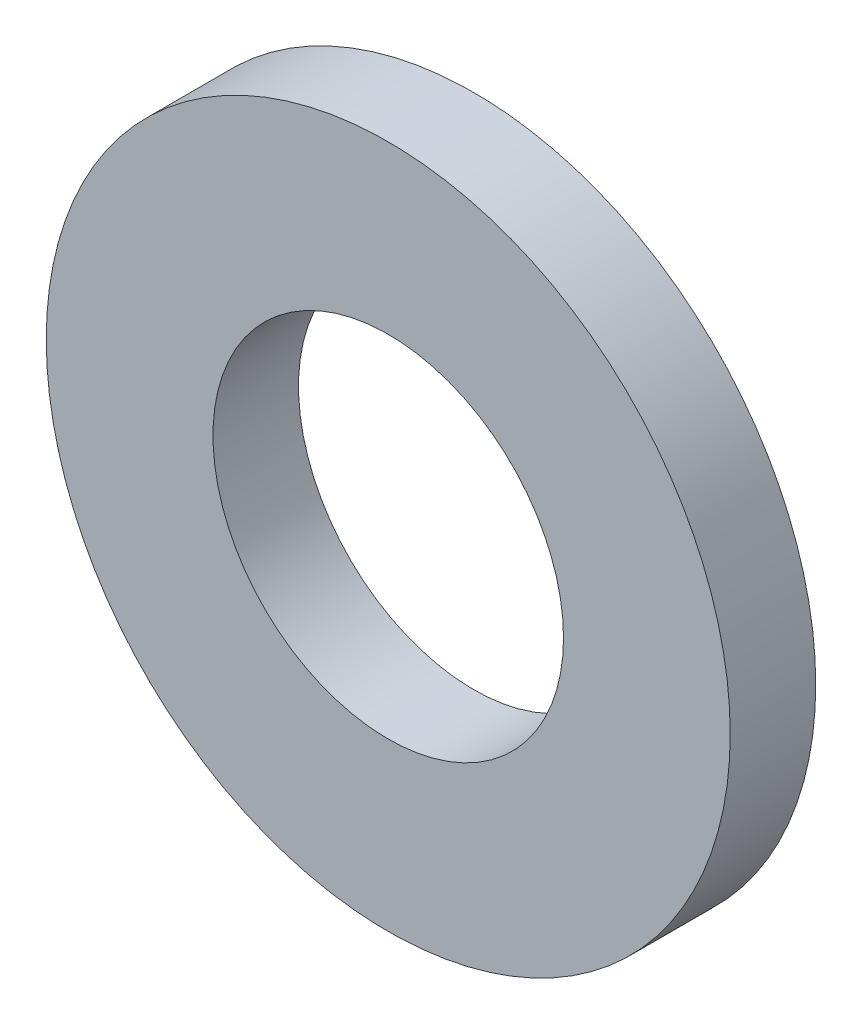
ISO-10303-21;
HEADER;
FILE_DESCRIPTION(('STEP AP214'),'2;1');
FILE_NAME('part.step','',(''),(''),'','','');
FILE_SCHEMA(('AUTOMOTIVE_DESIGN { 1 0 10303 214 1 1 1 1 }'));
ENDSEC;
DATA;
#1=APPLICATION_CONTEXT('core data for automotive mechanical design processes');
#2=APPLICATION_PROTOCOL_DEFINITION('international standard','automotive_design',2000,#1);
#3=PRODUCT_CONTEXT('',#1,'mechanical');
#4=PRODUCT('Part','Part','',(#3));
#5=PRODUCT_RELATED_PRODUCT_CATEGORY('part','',(#4));
#6=PRODUCT_DEFINITION_FORMATION('','',#4);
#7=PRODUCT_DEFINITION_CONTEXT('part definition',#1,'design');
#8=PRODUCT_DEFINITION('design','',#6,#7);
#9=PRODUCT_DEFINITION_SHAPE('','',#8);
#10=(LENGTH_UNIT() NAMED_UNIT(*) SI_UNIT(.MILLI.,.METRE.));
#11=(NAMED_UNIT(*) PLANE_ANGLE_UNIT() SI_UNIT($,.RADIAN.));
#12=(NAMED_UNIT(*) SI_UNIT($,.STERADIAN.) SOLID_ANGLE_UNIT());
#13=UNCERTAINTY_MEASURE_WITH_UNIT(LENGTH_MEASURE(1.E-05),#10,'distance_accuracy_value','');
#14=(GEOMETRIC_REPRESENTATION_CONTEXT(3) GLOBAL_UNCERTAINTY_ASSIGNED_CONTEXT((#13)) GLOBAL_UNIT_ASSIGNED_CONTEXT((#10,
#11,#12)) REPRESENTATION_CONTEXT('',''));
#15=CARTESIAN_POINT('',(0.,0.,0.));
#16=DIRECTION('',(0.,0.,1.));
#17=DIRECTION('',(1.,0.,0.));
#18=AXIS2_PLACEMENT_3D('',#15,#16,#17);
#19=CARTESIAN_POINT('',(0.,0.,1.));
#20=DIRECTION('',(0.,0.,-1.));
#21=DIRECTION('',(-1.,0.,0.));
#22=AXIS2_PLACEMENT_3D('',#19,#20,#21);
#23=CYLINDRICAL_SURFACE('',#22,4.);
#24=CARTESIAN_POINT('',(0.,0.,1.));
#25=DIRECTION('',(0.,0.,1.));
#26=DIRECTION('',(1.,0.,0.));
#27=AXIS2_PLACEMENT_3D('',#24,#25,#26);
#28=CIRCLE('',#27,4.);
#29=CARTESIAN_POINT('',(4.,0.,1.));
#30=VERTEX_POINT('',#29);
#31=EDGE_CURVE('E10',#30,#30,#28,.T.);
#32=ORIENTED_EDGE('',*,*,#31,.F.);
#33=EDGE_LOOP('',(#32));
#34=FACE_BOUND('',#33,.T.);
#35=CARTESIAN_POINT('',(0.,0.,0.));
#36=DIRECTION('',(0.,0.,1.));
#37=DIRECTION('',(1.,0.,0.));
#38=AXIS2_PLACEMENT_3D('',#35,#36,#37);
#39=CIRCLE('',#38,4.);
#40=CARTESIAN_POINT('',(4.,0.,0.));
#41=VERTEX_POINT('',#40);
#42=EDGE_CURVE('E40',#41,#41,#39,.T.);
#43=ORIENTED_EDGE('',*,*,#42,.T.);
#44=EDGE_LOOP('',(#43));
#45=FACE_BOUND('',#44,.T.);
#46=ADVANCED_FACE('F37',(#34,#45),#23,.T.);
#47=CARTESIAN_POINT('',(0.,0.,1.));
#48=DIRECTION('',(0.,0.,1.));
#49=DIRECTION('',(1.,0.,0.));
#50=AXIS2_PLACEMENT_3D('',#47,#48,#49);
#51=PLANE('',#50);
#52=CARTESIAN_POINT('',(0.,0.,1.));
#53=DIRECTION('',(0.,0.,1.));
#54=DIRECTION('',(1.,0.,0.));
#55=AXIS2_PLACEMENT_3D('',#52,#53,#54);
#56=CIRCLE('',#55,2.05);
#57=CARTESIAN_POINT('',(2.05,0.,1.));
#58=VERTEX_POINT('',#57);
#59=EDGE_CURVE('E51',#58,#58,#56,.T.);
#60=ORIENTED_EDGE('',*,*,#59,.F.);
#61=EDGE_LOOP('',(#60));
#62=FACE_BOUND('',#61,.T.);
#63=ORIENTED_EDGE('',*,*,#31,.T.);
#64=EDGE_LOOP('',(#63));
#65=FACE_BOUND('',#64,.T.);
#66=ADVANCED_FACE('F68',(#62,#65),#51,.T.);
#67=CARTESIAN_POINT('',(0.,0.,0.));
#68=DIRECTION('',(0.,0.,1.));
#69=DIRECTION('',(1.,0.,0.));
#70=AXIS2_PLACEMENT_3D('',#67,#68,#69);
#71=PLANE('',#70);
#72=CARTESIAN_POINT('',(0.,0.,0.));
#73=DIRECTION('',(0.,0.,1.));
#74=DIRECTION('',(1.,0.,0.));
#75=AXIS2_PLACEMENT_3D('',#72,#73,#74);
#76=CIRCLE('',#75,2.05);
#77=CARTESIAN_POINT('',(2.05,0.,0.));
#78=VERTEX_POINT('',#77);
#79=EDGE_CURVE('E49',#78,#78,#76,.T.);
#80=ORIENTED_EDGE('',*,*,#79,.T.);
#81=EDGE_LOOP('',(#80));
#82=FACE_BOUND('',#81,.T.);
#83=ORIENTED_EDGE('',*,*,#42,.F.);
#84=EDGE_LOOP('',(#83));
#85=FACE_BOUND('',#84,.T.);
#86=ADVANCED_FACE('F59',(#82,#85),#71,.F.);
#87=CARTESIAN_POINT('',(0.,0.,0.));
#88=DIRECTION('',(0.,0.,1.));
#89=DIRECTION('',(1.,0.,0.));
#90=AXIS2_PLACEMENT_3D('',#87,#88,#89);
#91=CYLINDRICAL_SURFACE('',#90,2.05);
#92=ORIENTED_EDGE('',*,*,#79,.F.);
#93=EDGE_LOOP('',(#92));
#94=FACE_BOUND('',#93,.T.);
#95=ORIENTED_EDGE('',*,*,#59,.T.);
#96=EDGE_LOOP('',(#95));
#97=FACE_BOUND('',#96,.T.);
#98=ADVANCED_FACE('F62',(#94,#97),#91,.F.);
#99=CLOSED_SHELL('',(#46,#66,#86,#98));
#100=MANIFOLD_SOLID_BREP('B2',#99);
#101=ADVANCED_BREP_SHAPE_REPRESENTATION('',(#18,#100),#14);
#102=SHAPE_DEFINITION_REPRESENTATION(#9,#101);
ENDSEC;
END-ISO-10303-21;
